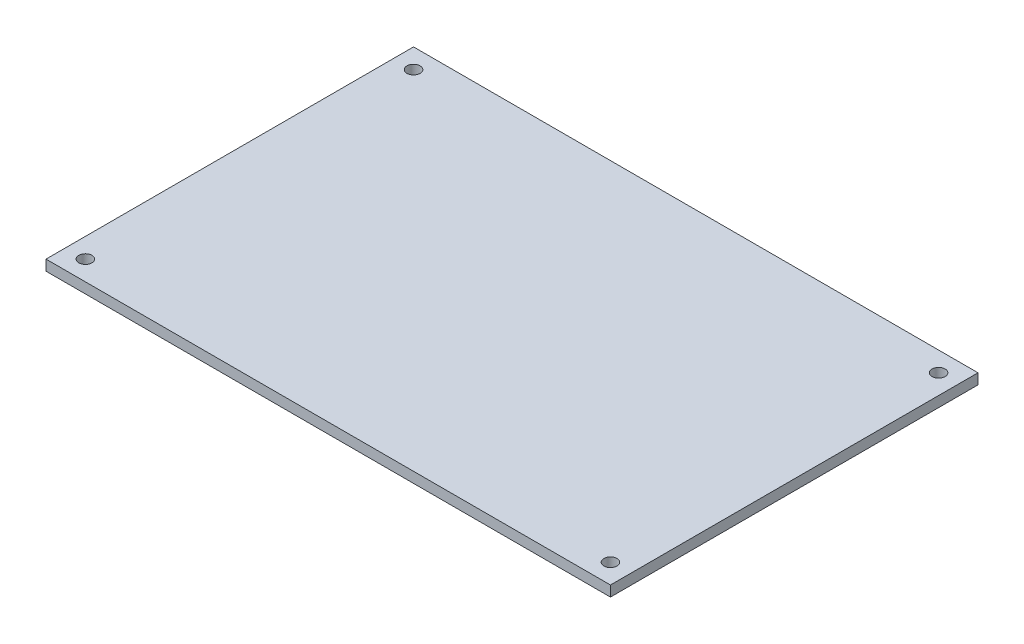
ISO-10303-21;
HEADER;
FILE_DESCRIPTION(('STEP AP214'),'2;1');
FILE_NAME('part.step','',(''),(''),'','','');
FILE_SCHEMA(('AUTOMOTIVE_DESIGN { 1 0 10303 214 1 1 1 1 }'));
ENDSEC;
DATA;
#1=APPLICATION_CONTEXT('core data for automotive mechanical design processes');
#2=APPLICATION_PROTOCOL_DEFINITION('international standard','automotive_design',2000,#1);
#3=PRODUCT_CONTEXT('',#1,'mechanical');
#4=PRODUCT('Part','Part','',(#3));
#5=PRODUCT_RELATED_PRODUCT_CATEGORY('part','',(#4));
#6=PRODUCT_DEFINITION_FORMATION('','',#4);
#7=PRODUCT_DEFINITION_CONTEXT('part definition',#1,'design');
#8=PRODUCT_DEFINITION('design','',#6,#7);
#9=PRODUCT_DEFINITION_SHAPE('','',#8);
#10=(LENGTH_UNIT() NAMED_UNIT(*) SI_UNIT(.MILLI.,.METRE.));
#11=(NAMED_UNIT(*) PLANE_ANGLE_UNIT() SI_UNIT($,.RADIAN.));
#12=(NAMED_UNIT(*) SI_UNIT($,.STERADIAN.) SOLID_ANGLE_UNIT());
#13=UNCERTAINTY_MEASURE_WITH_UNIT(LENGTH_MEASURE(1.E-05),#10,'distance_accuracy_value','');
#14=(GEOMETRIC_REPRESENTATION_CONTEXT(3) GLOBAL_UNCERTAINTY_ASSIGNED_CONTEXT((#13)) GLOBAL_UNIT_ASSIGNED_CONTEXT((#10,
#11,#12)) REPRESENTATION_CONTEXT('',''));
#15=CARTESIAN_POINT('',(0.,0.,0.));
#16=DIRECTION('',(0.,0.,1.));
#17=DIRECTION('',(1.,0.,0.));
#18=AXIS2_PLACEMENT_3D('',#15,#16,#17);
#19=CARTESIAN_POINT('',(0.,1.6,0.));
#20=DIRECTION('',(0.,-1.,0.));
#21=DIRECTION('',(0.,0.,-1.));
#22=AXIS2_PLACEMENT_3D('',#19,#20,#21);
#23=PLANE('',#22);
#24=DIRECTION('',(0.,0.,-1.));
#25=VECTOR('',#24,1.);
#26=CARTESIAN_POINT('',(43.,1.6,28.));
#27=LINE('',#26,#25);
#28=CARTESIAN_POINT('',(43.,1.6,28.));
#29=VERTEX_POINT('',#28);
#30=CARTESIAN_POINT('',(43.,1.6,-28.));
#31=VERTEX_POINT('',#30);
#32=EDGE_CURVE('E92',#29,#31,#27,.T.);
#33=ORIENTED_EDGE('',*,*,#32,.T.);
#34=DIRECTION('',(-1.,0.,0.));
#35=VECTOR('',#34,1.);
#36=CARTESIAN_POINT('',(-43.,1.6,-28.));
#37=LINE('',#36,#35);
#38=CARTESIAN_POINT('',(-43.,1.6,-28.));
#39=VERTEX_POINT('',#38);
#40=EDGE_CURVE('E87',#31,#39,#37,.T.);
#41=ORIENTED_EDGE('',*,*,#40,.T.);
#42=DIRECTION('',(0.,0.,1.));
#43=VECTOR('',#42,1.);
#44=CARTESIAN_POINT('',(-43.,1.6,28.));
#45=LINE('',#44,#43);
#46=CARTESIAN_POINT('',(-43.,1.6,28.));
#47=VERTEX_POINT('',#46);
#48=EDGE_CURVE('E90',#39,#47,#45,.T.);
#49=ORIENTED_EDGE('',*,*,#48,.T.);
#50=DIRECTION('',(1.,0.,0.));
#51=VECTOR('',#50,1.);
#52=CARTESIAN_POINT('',(-43.,1.6,28.));
#53=LINE('',#52,#51);
#54=EDGE_CURVE('E57',#47,#29,#53,.T.);
#55=ORIENTED_EDGE('',*,*,#54,.T.);
#56=EDGE_LOOP('',(#33,#41,#49,#55));
#57=FACE_BOUND('',#56,.T.);
#58=CARTESIAN_POINT('',(-40.,1.6,-25.));
#59=DIRECTION('',(0.,1.,0.));
#60=DIRECTION('',(0.,0.,1.));
#61=AXIS2_PLACEMENT_3D('',#58,#59,#60);
#62=CIRCLE('',#61,0.999999999999998);
#63=CARTESIAN_POINT('',(-40.,1.6,-24.));
#64=VERTEX_POINT('',#63);
#65=EDGE_CURVE('E112',#64,#64,#62,.T.);
#66=ORIENTED_EDGE('',*,*,#65,.F.);
#67=EDGE_LOOP('',(#66));
#68=FACE_BOUND('',#67,.T.);
#69=CARTESIAN_POINT('',(40.,1.6,-25.));
#70=DIRECTION('',(0.,1.,0.));
#71=DIRECTION('',(0.,0.,-1.));
#72=AXIS2_PLACEMENT_3D('',#69,#70,#71);
#73=CIRCLE('',#72,0.999999999999998);
#74=CARTESIAN_POINT('',(40.,1.6,-26.));
#75=VERTEX_POINT('',#74);
#76=EDGE_CURVE('E134',#75,#75,#73,.T.);
#77=ORIENTED_EDGE('',*,*,#76,.F.);
#78=EDGE_LOOP('',(#77));
#79=FACE_BOUND('',#78,.T.);
#80=CARTESIAN_POINT('',(40.,1.6,25.));
#81=DIRECTION('',(0.,1.,0.));
#82=DIRECTION('',(0.,0.,1.));
#83=AXIS2_PLACEMENT_3D('',#80,#81,#82);
#84=CIRCLE('',#83,0.999999999999998);
#85=CARTESIAN_POINT('',(40.,1.6,26.));
#86=VERTEX_POINT('',#85);
#87=EDGE_CURVE('E142',#86,#86,#84,.T.);
#88=ORIENTED_EDGE('',*,*,#87,.F.);
#89=EDGE_LOOP('',(#88));
#90=FACE_BOUND('',#89,.T.);
#91=CARTESIAN_POINT('',(-40.,1.6,25.));
#92=DIRECTION('',(0.,1.,0.));
#93=DIRECTION('',(0.,0.,-1.));
#94=AXIS2_PLACEMENT_3D('',#91,#92,#93);
#95=CIRCLE('',#94,0.999999999999998);
#96=CARTESIAN_POINT('',(-40.,1.6,24.));
#97=VERTEX_POINT('',#96);
#98=EDGE_CURVE('E150',#97,#97,#95,.T.);
#99=ORIENTED_EDGE('',*,*,#98,.F.);
#100=EDGE_LOOP('',(#99));
#101=FACE_BOUND('',#100,.T.);
#102=ADVANCED_FACE('F39',(#57,#68,#79,#90,#101),#23,.F.);
#103=CARTESIAN_POINT('',(0.,0.,0.));
#104=DIRECTION('',(0.,-1.,0.));
#105=DIRECTION('',(0.,0.,-1.));
#106=AXIS2_PLACEMENT_3D('',#103,#104,#105);
#107=PLANE('',#106);
#108=CARTESIAN_POINT('',(40.,0.,25.));
#109=DIRECTION('',(0.,1.,0.));
#110=DIRECTION('',(0.,0.,1.));
#111=AXIS2_PLACEMENT_3D('',#108,#109,#110);
#112=CIRCLE('',#111,0.999999999999998);
#113=CARTESIAN_POINT('',(40.,0.,26.));
#114=VERTEX_POINT('',#113);
#115=EDGE_CURVE('E146',#114,#114,#112,.T.);
#116=ORIENTED_EDGE('',*,*,#115,.T.);
#117=EDGE_LOOP('',(#116));
#118=FACE_BOUND('',#117,.T.);
#119=CARTESIAN_POINT('',(-40.,0.,-25.));
#120=DIRECTION('',(0.,1.,0.));
#121=DIRECTION('',(0.,0.,1.));
#122=AXIS2_PLACEMENT_3D('',#119,#120,#121);
#123=CIRCLE('',#122,0.999999999999998);
#124=CARTESIAN_POINT('',(-40.,0.,-24.));
#125=VERTEX_POINT('',#124);
#126=EDGE_CURVE('E130',#125,#125,#123,.T.);
#127=ORIENTED_EDGE('',*,*,#126,.T.);
#128=EDGE_LOOP('',(#127));
#129=FACE_BOUND('',#128,.T.);
#130=DIRECTION('',(0.,0.,-1.));
#131=VECTOR('',#130,1.);
#132=CARTESIAN_POINT('',(43.,0.,28.));
#133=LINE('',#132,#131);
#134=CARTESIAN_POINT('',(43.,0.,28.));
#135=VERTEX_POINT('',#134);
#136=CARTESIAN_POINT('',(43.,0.,-28.));
#137=VERTEX_POINT('',#136);
#138=EDGE_CURVE('E108',#135,#137,#133,.T.);
#139=ORIENTED_EDGE('',*,*,#138,.F.);
#140=DIRECTION('',(1.,0.,0.));
#141=VECTOR('',#140,1.);
#142=CARTESIAN_POINT('',(-43.,0.,28.));
#143=LINE('',#142,#141);
#144=CARTESIAN_POINT('',(-43.,0.,28.));
#145=VERTEX_POINT('',#144);
#146=EDGE_CURVE('E80',#145,#135,#143,.T.);
#147=ORIENTED_EDGE('',*,*,#146,.F.);
#148=DIRECTION('',(0.,0.,1.));
#149=VECTOR('',#148,1.);
#150=CARTESIAN_POINT('',(-43.,0.,28.));
#151=LINE('',#150,#149);
#152=CARTESIAN_POINT('',(-43.,0.,-28.));
#153=VERTEX_POINT('',#152);
#154=EDGE_CURVE('E74',#153,#145,#151,.T.);
#155=ORIENTED_EDGE('',*,*,#154,.F.);
#156=DIRECTION('',(-1.,0.,0.));
#157=VECTOR('',#156,1.);
#158=CARTESIAN_POINT('',(-43.,0.,-28.));
#159=LINE('',#158,#157);
#160=EDGE_CURVE('E97',#137,#153,#159,.T.);
#161=ORIENTED_EDGE('',*,*,#160,.F.);
#162=EDGE_LOOP('',(#139,#147,#155,#161));
#163=FACE_BOUND('',#162,.T.);
#164=CARTESIAN_POINT('',(40.,0.,-25.));
#165=DIRECTION('',(0.,1.,0.));
#166=DIRECTION('',(0.,0.,-1.));
#167=AXIS2_PLACEMENT_3D('',#164,#165,#166);
#168=CIRCLE('',#167,0.999999999999998);
#169=CARTESIAN_POINT('',(40.,0.,-26.));
#170=VERTEX_POINT('',#169);
#171=EDGE_CURVE('E138',#170,#170,#168,.T.);
#172=ORIENTED_EDGE('',*,*,#171,.T.);
#173=EDGE_LOOP('',(#172));
#174=FACE_BOUND('',#173,.T.);
#175=CARTESIAN_POINT('',(-40.,0.,25.));
#176=DIRECTION('',(0.,1.,0.));
#177=DIRECTION('',(0.,0.,-1.));
#178=AXIS2_PLACEMENT_3D('',#175,#176,#177);
#179=CIRCLE('',#178,0.999999999999998);
#180=CARTESIAN_POINT('',(-40.,0.,24.));
#181=VERTEX_POINT('',#180);
#182=EDGE_CURVE('E154',#181,#181,#179,.T.);
#183=ORIENTED_EDGE('',*,*,#182,.T.);
#184=EDGE_LOOP('',(#183));
#185=FACE_BOUND('',#184,.T.);
#186=ADVANCED_FACE('F125',(#118,#129,#163,#174,#185),#107,.T.);
#187=CARTESIAN_POINT('',(43.,1.6,28.));
#188=DIRECTION('',(-1.,0.,0.));
#189=DIRECTION('',(0.,0.,1.));
#190=AXIS2_PLACEMENT_3D('',#187,#188,#189);
#191=PLANE('',#190);
#192=ORIENTED_EDGE('',*,*,#138,.T.);
#193=DIRECTION('',(0.,-1.,0.));
#194=VECTOR('',#193,1.);
#195=CARTESIAN_POINT('',(43.,1.6,-28.));
#196=LINE('',#195,#194);
#197=EDGE_CURVE('E11',#31,#137,#196,.T.);
#198=ORIENTED_EDGE('',*,*,#197,.F.);
#199=ORIENTED_EDGE('',*,*,#32,.F.);
#200=DIRECTION('',(0.,-1.,0.));
#201=VECTOR('',#200,1.);
#202=CARTESIAN_POINT('',(43.,1.6,28.));
#203=LINE('',#202,#201);
#204=EDGE_CURVE('E104',#29,#135,#203,.T.);
#205=ORIENTED_EDGE('',*,*,#204,.T.);
#206=EDGE_LOOP('',(#192,#198,#199,#205));
#207=FACE_BOUND('',#206,.T.);
#208=ADVANCED_FACE('F41',(#207),#191,.F.);
#209=CARTESIAN_POINT('',(-43.,1.6,-28.));
#210=DIRECTION('',(0.,0.,1.));
#211=DIRECTION('',(1.,0.,0.));
#212=AXIS2_PLACEMENT_3D('',#209,#210,#211);
#213=PLANE('',#212);
#214=ORIENTED_EDGE('',*,*,#160,.T.);
#215=DIRECTION('',(0.,-1.,0.));
#216=VECTOR('',#215,1.);
#217=CARTESIAN_POINT('',(-43.,1.6,-28.));
#218=LINE('',#217,#216);
#219=EDGE_CURVE('E49',#39,#153,#218,.T.);
#220=ORIENTED_EDGE('',*,*,#219,.F.);
#221=ORIENTED_EDGE('',*,*,#40,.F.);
#222=ORIENTED_EDGE('',*,*,#197,.T.);
#223=EDGE_LOOP('',(#214,#220,#221,#222));
#224=FACE_BOUND('',#223,.T.);
#225=ADVANCED_FACE('F96',(#224),#213,.F.);
#226=CARTESIAN_POINT('',(-43.,1.6,28.));
#227=DIRECTION('',(1.,0.,0.));
#228=DIRECTION('',(0.,0.,-1.));
#229=AXIS2_PLACEMENT_3D('',#226,#227,#228);
#230=PLANE('',#229);
#231=ORIENTED_EDGE('',*,*,#154,.T.);
#232=DIRECTION('',(0.,-1.,0.));
#233=VECTOR('',#232,1.);
#234=CARTESIAN_POINT('',(-43.,1.6,28.));
#235=LINE('',#234,#233);
#236=EDGE_CURVE('E99',#47,#145,#235,.T.);
#237=ORIENTED_EDGE('',*,*,#236,.F.);
#238=ORIENTED_EDGE('',*,*,#48,.F.);
#239=ORIENTED_EDGE('',*,*,#219,.T.);
#240=EDGE_LOOP('',(#231,#237,#238,#239));
#241=FACE_BOUND('',#240,.T.);
#242=ADVANCED_FACE('F100',(#241),#230,.F.);
#243=CARTESIAN_POINT('',(-43.,1.6,28.));
#244=DIRECTION('',(0.,0.,-1.));
#245=DIRECTION('',(-1.,0.,0.));
#246=AXIS2_PLACEMENT_3D('',#243,#244,#245);
#247=PLANE('',#246);
#248=ORIENTED_EDGE('',*,*,#146,.T.);
#249=ORIENTED_EDGE('',*,*,#204,.F.);
#250=ORIENTED_EDGE('',*,*,#54,.F.);
#251=ORIENTED_EDGE('',*,*,#236,.T.);
#252=EDGE_LOOP('',(#248,#249,#250,#251));
#253=FACE_BOUND('',#252,.T.);
#254=ADVANCED_FACE('F122',(#253),#247,.F.);
#255=CARTESIAN_POINT('',(-40.,1.6,-25.));
#256=DIRECTION('',(0.,-1.,0.));
#257=DIRECTION('',(0.,0.,-1.));
#258=AXIS2_PLACEMENT_3D('',#255,#256,#257);
#259=CYLINDRICAL_SURFACE('',#258,0.999999999999998);
#260=ORIENTED_EDGE('',*,*,#65,.T.);
#261=EDGE_LOOP('',(#260));
#262=FACE_BOUND('',#261,.T.);
#263=ORIENTED_EDGE('',*,*,#126,.F.);
#264=EDGE_LOOP('',(#263));
#265=FACE_BOUND('',#264,.T.);
#266=ADVANCED_FACE('F173',(#262,#265),#259,.F.);
#267=CARTESIAN_POINT('',(40.,1.6,-25.));
#268=DIRECTION('',(0.,-1.,0.));
#269=DIRECTION('',(0.,0.,-1.));
#270=AXIS2_PLACEMENT_3D('',#267,#268,#269);
#271=CYLINDRICAL_SURFACE('',#270,0.999999999999998);
#272=ORIENTED_EDGE('',*,*,#76,.T.);
#273=EDGE_LOOP('',(#272));
#274=FACE_BOUND('',#273,.T.);
#275=ORIENTED_EDGE('',*,*,#171,.F.);
#276=EDGE_LOOP('',(#275));
#277=FACE_BOUND('',#276,.T.);
#278=ADVANCED_FACE('F219',(#274,#277),#271,.F.);
#279=CARTESIAN_POINT('',(40.,1.6,25.));
#280=DIRECTION('',(0.,-1.,0.));
#281=DIRECTION('',(0.,0.,-1.));
#282=AXIS2_PLACEMENT_3D('',#279,#280,#281);
#283=CYLINDRICAL_SURFACE('',#282,0.999999999999998);
#284=ORIENTED_EDGE('',*,*,#87,.T.);
#285=EDGE_LOOP('',(#284));
#286=FACE_BOUND('',#285,.T.);
#287=ORIENTED_EDGE('',*,*,#115,.F.);
#288=EDGE_LOOP('',(#287));
#289=FACE_BOUND('',#288,.T.);
#290=ADVANCED_FACE('F227',(#286,#289),#283,.F.);
#291=CARTESIAN_POINT('',(-40.,1.6,25.));
#292=DIRECTION('',(0.,-1.,0.));
#293=DIRECTION('',(0.,0.,-1.));
#294=AXIS2_PLACEMENT_3D('',#291,#292,#293);
#295=CYLINDRICAL_SURFACE('',#294,0.999999999999998);
#296=ORIENTED_EDGE('',*,*,#98,.T.);
#297=EDGE_LOOP('',(#296));
#298=FACE_BOUND('',#297,.T.);
#299=ORIENTED_EDGE('',*,*,#182,.F.);
#300=EDGE_LOOP('',(#299));
#301=FACE_BOUND('',#300,.T.);
#302=ADVANCED_FACE('F162',(#298,#301),#295,.F.);
#303=CLOSED_SHELL('',(#102,#186,#208,#225,#242,#254,#266,#278,#290,#302));
#304=MANIFOLD_SOLID_BREP('B2',#303);
#305=ADVANCED_BREP_SHAPE_REPRESENTATION('',(#18,#304),#14);
#306=SHAPE_DEFINITION_REPRESENTATION(#9,#305);
ENDSEC;
END-ISO-10303-21;
